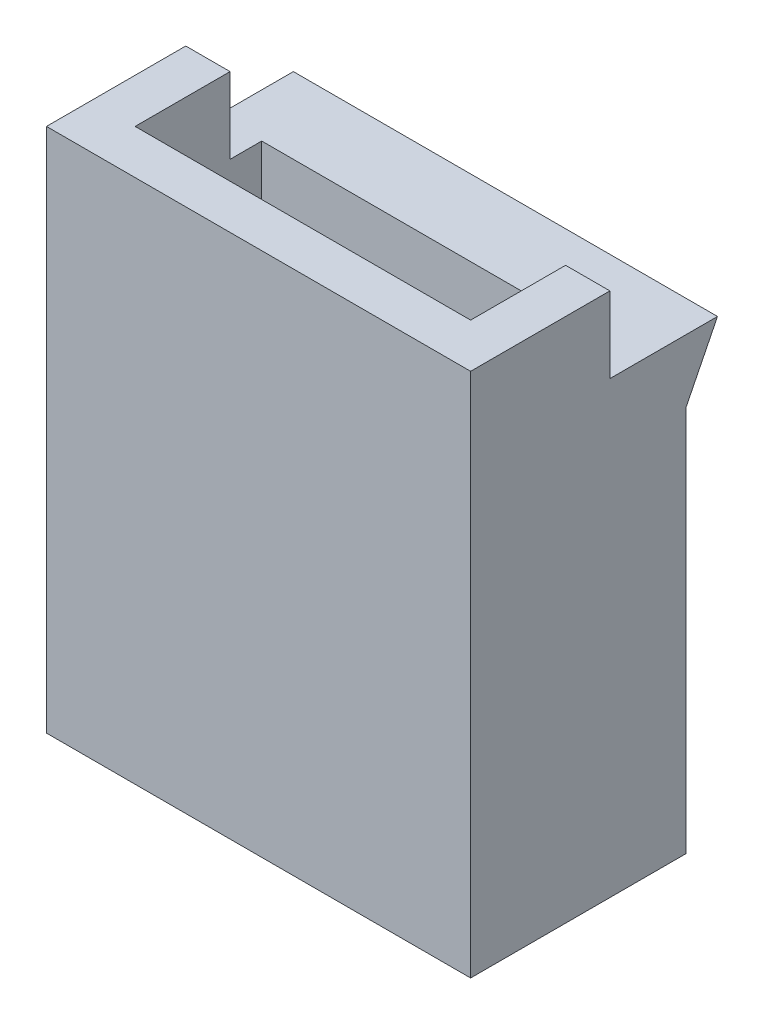
ISO-10303-21;
HEADER;
FILE_DESCRIPTION(('STEP AP214'),'2;1');
FILE_NAME('part.step','',(''),(''),'','','');
FILE_SCHEMA(('AUTOMOTIVE_DESIGN { 1 0 10303 214 1 1 1 1 }'));
ENDSEC;
DATA;
#1=APPLICATION_CONTEXT('core data for automotive mechanical design processes');
#2=APPLICATION_PROTOCOL_DEFINITION('international standard','automotive_design',2000,#1);
#3=PRODUCT_CONTEXT('',#1,'mechanical');
#4=PRODUCT('Part','Part','',(#3));
#5=PRODUCT_RELATED_PRODUCT_CATEGORY('part','',(#4));
#6=PRODUCT_DEFINITION_FORMATION('','',#4);
#7=PRODUCT_DEFINITION_CONTEXT('part definition',#1,'design');
#8=PRODUCT_DEFINITION('design','',#6,#7);
#9=PRODUCT_DEFINITION_SHAPE('','',#8);
#10=(LENGTH_UNIT() NAMED_UNIT(*) SI_UNIT(.MILLI.,.METRE.));
#11=(NAMED_UNIT(*) PLANE_ANGLE_UNIT() SI_UNIT($,.RADIAN.));
#12=(NAMED_UNIT(*) SI_UNIT($,.STERADIAN.) SOLID_ANGLE_UNIT());
#13=UNCERTAINTY_MEASURE_WITH_UNIT(LENGTH_MEASURE(1.E-05),#10,'distance_accuracy_value','');
#14=(GEOMETRIC_REPRESENTATION_CONTEXT(3) GLOBAL_UNCERTAINTY_ASSIGNED_CONTEXT((#13)) GLOBAL_UNIT_ASSIGNED_CONTEXT((#10,
#11,#12)) REPRESENTATION_CONTEXT('',''));
#15=CARTESIAN_POINT('',(0.,0.,0.));
#16=DIRECTION('',(0.,0.,1.));
#17=DIRECTION('',(1.,0.,0.));
#18=AXIS2_PLACEMENT_3D('',#15,#16,#17);
#19=CARTESIAN_POINT('',(0.,0.,0.));
#20=DIRECTION('',(0.,1.,0.));
#21=DIRECTION('',(1.,0.,0.));
#22=AXIS2_PLACEMENT_3D('',#19,#20,#21);
#23=PLANE('',#22);
#24=DIRECTION('',(0.,0.,1.));
#25=VECTOR('',#24,1.);
#26=CARTESIAN_POINT('',(-3.35,0.,-0.5));
#27=LINE('',#26,#25);
#28=CARTESIAN_POINT('',(-3.35,0.,-0.5));
#29=VERTEX_POINT('',#28);
#30=CARTESIAN_POINT('',(-3.35,0.,1.7));
#31=VERTEX_POINT('',#30);
#32=EDGE_CURVE('E11',#29,#31,#27,.T.);
#33=ORIENTED_EDGE('',*,*,#32,.T.);
#34=DIRECTION('',(1.,0.,0.));
#35=VECTOR('',#34,1.);
#36=CARTESIAN_POINT('',(-3.35,0.,1.7));
#37=LINE('',#36,#35);
#38=CARTESIAN_POINT('',(3.35,0.,1.7));
#39=VERTEX_POINT('',#38);
#40=EDGE_CURVE('E27',#31,#39,#37,.T.);
#41=ORIENTED_EDGE('',*,*,#40,.T.);
#42=DIRECTION('',(0.,0.,-1.));
#43=VECTOR('',#42,1.);
#44=CARTESIAN_POINT('',(3.35,0.,1.7));
#45=LINE('',#44,#43);
#46=CARTESIAN_POINT('',(3.35,0.,-0.5));
#47=VERTEX_POINT('',#46);
#48=EDGE_CURVE('E162',#39,#47,#45,.T.);
#49=ORIENTED_EDGE('',*,*,#48,.T.);
#50=DIRECTION('',(1.,0.,0.));
#51=VECTOR('',#50,1.);
#52=CARTESIAN_POINT('',(2.65,0.,-0.5));
#53=LINE('',#52,#51);
#54=CARTESIAN_POINT('',(2.65,0.,-0.5));
#55=VERTEX_POINT('',#54);
#56=EDGE_CURVE('E199',#55,#47,#53,.T.);
#57=ORIENTED_EDGE('',*,*,#56,.F.);
#58=DIRECTION('',(0.,0.,-1.));
#59=VECTOR('',#58,1.);
#60=CARTESIAN_POINT('',(2.65,0.,1.));
#61=LINE('',#60,#59);
#62=CARTESIAN_POINT('',(2.65,0.,1.));
#63=VERTEX_POINT('',#62);
#64=EDGE_CURVE('E152',#63,#55,#61,.T.);
#65=ORIENTED_EDGE('',*,*,#64,.F.);
#66=DIRECTION('',(1.,0.,0.));
#67=VECTOR('',#66,1.);
#68=CARTESIAN_POINT('',(-2.65,0.,1.));
#69=LINE('',#68,#67);
#70=CARTESIAN_POINT('',(-2.65,0.,1.));
#71=VERTEX_POINT('',#70);
#72=EDGE_CURVE('E129',#71,#63,#69,.T.);
#73=ORIENTED_EDGE('',*,*,#72,.F.);
#74=DIRECTION('',(0.,0.,1.));
#75=VECTOR('',#74,1.);
#76=CARTESIAN_POINT('',(-2.65,0.,-0.5));
#77=LINE('',#76,#75);
#78=CARTESIAN_POINT('',(-2.65,0.,-0.5));
#79=VERTEX_POINT('',#78);
#80=EDGE_CURVE('E126',#79,#71,#77,.T.);
#81=ORIENTED_EDGE('',*,*,#80,.F.);
#82=DIRECTION('',(1.,0.,0.));
#83=VECTOR('',#82,1.);
#84=CARTESIAN_POINT('',(-3.35,0.,-0.5));
#85=LINE('',#84,#83);
#86=EDGE_CURVE('E155',#29,#79,#85,.T.);
#87=ORIENTED_EDGE('',*,*,#86,.F.);
#88=EDGE_LOOP('',(#33,#41,#49,#57,#65,#73,#81,#87));
#89=FACE_BOUND('',#88,.T.);
#90=ADVANCED_FACE('F17',(#89),#23,.T.);
#91=CARTESIAN_POINT('',(-3.35,0.,-0.5));
#92=DIRECTION('',(0.,0.,1.));
#93=DIRECTION('',(1.,0.,0.));
#94=AXIS2_PLACEMENT_3D('',#91,#92,#93);
#95=PLANE('',#94);
#96=DIRECTION('',(0.,-1.,0.));
#97=VECTOR('',#96,1.);
#98=CARTESIAN_POINT('',(-2.65,0.,-0.5));
#99=LINE('',#98,#97);
#100=CARTESIAN_POINT('',(-2.65,-1.2,-0.5));
#101=VERTEX_POINT('',#100);
#102=EDGE_CURVE('E158',#79,#101,#99,.T.);
#103=ORIENTED_EDGE('',*,*,#102,.T.);
#104=DIRECTION('',(1.,0.,0.));
#105=VECTOR('',#104,1.);
#106=CARTESIAN_POINT('',(-3.35,-1.2,-0.5));
#107=LINE('',#106,#105);
#108=CARTESIAN_POINT('',(-3.35,-1.2,-0.5));
#109=VERTEX_POINT('',#108);
#110=EDGE_CURVE('E163',#109,#101,#107,.T.);
#111=ORIENTED_EDGE('',*,*,#110,.F.);
#112=DIRECTION('',(0.,-1.,0.));
#113=VECTOR('',#112,1.);
#114=CARTESIAN_POINT('',(-3.35,0.,-0.5));
#115=LINE('',#114,#113);
#116=EDGE_CURVE('E166',#29,#109,#115,.T.);
#117=ORIENTED_EDGE('',*,*,#116,.F.);
#118=ORIENTED_EDGE('',*,*,#86,.T.);
#119=EDGE_LOOP('',(#103,#111,#117,#118));
#120=FACE_BOUND('',#119,.T.);
#121=ADVANCED_FACE('F251',(#120),#95,.F.);
#122=CARTESIAN_POINT('',(-3.35,0.,-1.7));
#123=DIRECTION('',(-1.,0.,0.));
#124=DIRECTION('',(0.,0.,1.));
#125=AXIS2_PLACEMENT_3D('',#122,#123,#124);
#126=PLANE('',#125);
#127=DIRECTION('',(0.,-1.,0.));
#128=VECTOR('',#127,1.);
#129=CARTESIAN_POINT('',(-3.35,-2.2,-1.7));
#130=LINE('',#129,#128);
#131=CARTESIAN_POINT('',(-3.35,-2.2,-1.7));
#132=VERTEX_POINT('',#131);
#133=CARTESIAN_POINT('',(-3.35,-8.3,-1.7));
#134=VERTEX_POINT('',#133);
#135=EDGE_CURVE('E159',#132,#134,#130,.T.);
#136=ORIENTED_EDGE('',*,*,#135,.T.);
#137=DIRECTION('',(0.,0.,1.));
#138=VECTOR('',#137,1.);
#139=CARTESIAN_POINT('',(-3.35,-8.3,-1.7));
#140=LINE('',#139,#138);
#141=CARTESIAN_POINT('',(-3.35,-8.3,1.7));
#142=VERTEX_POINT('',#141);
#143=EDGE_CURVE('E169',#134,#142,#140,.T.);
#144=ORIENTED_EDGE('',*,*,#143,.T.);
#145=DIRECTION('',(0.,-1.,0.));
#146=VECTOR('',#145,1.);
#147=CARTESIAN_POINT('',(-3.35,0.,1.7));
#148=LINE('',#147,#146);
#149=EDGE_CURVE('E175',#31,#142,#148,.T.);
#150=ORIENTED_EDGE('',*,*,#149,.F.);
#151=ORIENTED_EDGE('',*,*,#32,.F.);
#152=ORIENTED_EDGE('',*,*,#116,.T.);
#153=DIRECTION('',(0.,0.,1.));
#154=VECTOR('',#153,1.);
#155=CARTESIAN_POINT('',(-3.35,-1.2,-2.2));
#156=LINE('',#155,#154);
#157=CARTESIAN_POINT('',(-3.35,-1.2,-2.2));
#158=VERTEX_POINT('',#157);
#159=EDGE_CURVE('E165',#158,#109,#156,.T.);
#160=ORIENTED_EDGE('',*,*,#159,.F.);
#161=DIRECTION('',(0.,0.894427190999896,-0.447213595499998));
#162=VECTOR('',#161,1.);
#163=CARTESIAN_POINT('',(-3.35,-2.2,-1.7));
#164=LINE('',#163,#162);
#165=EDGE_CURVE('E170',#132,#158,#164,.T.);
#166=ORIENTED_EDGE('',*,*,#165,.F.);
#167=EDGE_LOOP('',(#136,#144,#150,#151,#152,#160,#166));
#168=FACE_BOUND('',#167,.T.);
#169=ADVANCED_FACE('F256',(#168),#126,.T.);
#170=CARTESIAN_POINT('',(0.,-1.7,-1.95));
#171=DIRECTION('',(0.,-0.447213595499998,-0.894427190999896));
#172=DIRECTION('',(0.,0.894427190999896,-0.447213595499998));
#173=AXIS2_PLACEMENT_3D('',#170,#171,#172);
#174=PLANE('',#173);
#175=DIRECTION('',(1.,0.,0.));
#176=VECTOR('',#175,1.);
#177=CARTESIAN_POINT('',(-3.35,-2.2,-1.7));
#178=LINE('',#177,#176);
#179=CARTESIAN_POINT('',(3.35,-2.2,-1.7));
#180=VERTEX_POINT('',#179);
#181=EDGE_CURVE('E177',#132,#180,#178,.T.);
#182=ORIENTED_EDGE('',*,*,#181,.F.);
#183=ORIENTED_EDGE('',*,*,#165,.T.);
#184=DIRECTION('',(1.,0.,0.));
#185=VECTOR('',#184,1.);
#186=CARTESIAN_POINT('',(-3.35,-1.2,-2.2));
#187=LINE('',#186,#185);
#188=CARTESIAN_POINT('',(3.35,-1.2,-2.2));
#189=VERTEX_POINT('',#188);
#190=EDGE_CURVE('E184',#158,#189,#187,.T.);
#191=ORIENTED_EDGE('',*,*,#190,.T.);
#192=DIRECTION('',(0.,-0.894427190999896,0.447213595499998));
#193=VECTOR('',#192,1.);
#194=CARTESIAN_POINT('',(3.35,-1.2,-2.2));
#195=LINE('',#194,#193);
#196=EDGE_CURVE('E189',#189,#180,#195,.T.);
#197=ORIENTED_EDGE('',*,*,#196,.T.);
#198=EDGE_LOOP('',(#182,#183,#191,#197));
#199=FACE_BOUND('',#198,.T.);
#200=ADVANCED_FACE('F262',(#199),#174,.T.);
#201=CARTESIAN_POINT('',(3.35,0.,1.7));
#202=DIRECTION('',(1.,0.,0.));
#203=DIRECTION('',(0.,0.,-1.));
#204=AXIS2_PLACEMENT_3D('',#201,#202,#203);
#205=PLANE('',#204);
#206=DIRECTION('',(0.,0.,-1.));
#207=VECTOR('',#206,1.);
#208=CARTESIAN_POINT('',(3.35,-1.2,-0.5));
#209=LINE('',#208,#207);
#210=CARTESIAN_POINT('',(3.35,-1.2,-0.5));
#211=VERTEX_POINT('',#210);
#212=EDGE_CURVE('E143',#211,#189,#209,.T.);
#213=ORIENTED_EDGE('',*,*,#212,.F.);
#214=DIRECTION('',(0.,-1.,0.));
#215=VECTOR('',#214,1.);
#216=CARTESIAN_POINT('',(3.35,0.,-0.5));
#217=LINE('',#216,#215);
#218=EDGE_CURVE('E196',#47,#211,#217,.T.);
#219=ORIENTED_EDGE('',*,*,#218,.F.);
#220=ORIENTED_EDGE('',*,*,#48,.F.);
#221=DIRECTION('',(0.,-1.,0.));
#222=VECTOR('',#221,1.);
#223=CARTESIAN_POINT('',(3.35,0.,1.7));
#224=LINE('',#223,#222);
#225=CARTESIAN_POINT('',(3.35,-8.3,1.7));
#226=VERTEX_POINT('',#225);
#227=EDGE_CURVE('E192',#39,#226,#224,.T.);
#228=ORIENTED_EDGE('',*,*,#227,.T.);
#229=DIRECTION('',(0.,0.,-1.));
#230=VECTOR('',#229,1.);
#231=CARTESIAN_POINT('',(3.35,-8.3,1.7));
#232=LINE('',#231,#230);
#233=CARTESIAN_POINT('',(3.35,-8.3,-1.7));
#234=VERTEX_POINT('',#233);
#235=EDGE_CURVE('E202',#226,#234,#232,.T.);
#236=ORIENTED_EDGE('',*,*,#235,.T.);
#237=DIRECTION('',(0.,-1.,0.));
#238=VECTOR('',#237,1.);
#239=CARTESIAN_POINT('',(3.35,-2.2,-1.7));
#240=LINE('',#239,#238);
#241=EDGE_CURVE('E205',#180,#234,#240,.T.);
#242=ORIENTED_EDGE('',*,*,#241,.F.);
#243=ORIENTED_EDGE('',*,*,#196,.F.);
#244=EDGE_LOOP('',(#213,#219,#220,#228,#236,#242,#243));
#245=FACE_BOUND('',#244,.T.);
#246=ADVANCED_FACE('F230',(#245),#205,.T.);
#247=CARTESIAN_POINT('',(3.35,0.,-1.7));
#248=DIRECTION('',(0.,0.,-1.));
#249=DIRECTION('',(-1.,0.,0.));
#250=AXIS2_PLACEMENT_3D('',#247,#248,#249);
#251=PLANE('',#250);
#252=ORIENTED_EDGE('',*,*,#241,.T.);
#253=DIRECTION('',(-1.,0.,0.));
#254=VECTOR('',#253,1.);
#255=CARTESIAN_POINT('',(3.35,-8.3,-1.7));
#256=LINE('',#255,#254);
#257=EDGE_CURVE('E186',#234,#134,#256,.T.);
#258=ORIENTED_EDGE('',*,*,#257,.T.);
#259=ORIENTED_EDGE('',*,*,#135,.F.);
#260=ORIENTED_EDGE('',*,*,#181,.T.);
#261=EDGE_LOOP('',(#252,#258,#259,#260));
#262=FACE_BOUND('',#261,.T.);
#263=ADVANCED_FACE('F269',(#262),#251,.T.);
#264=CARTESIAN_POINT('',(0.,-8.3,0.));
#265=DIRECTION('',(0.,1.,0.));
#266=DIRECTION('',(1.,0.,0.));
#267=AXIS2_PLACEMENT_3D('',#264,#265,#266);
#268=PLANE('',#267);
#269=ORIENTED_EDGE('',*,*,#143,.F.);
#270=ORIENTED_EDGE('',*,*,#257,.F.);
#271=ORIENTED_EDGE('',*,*,#235,.F.);
#272=DIRECTION('',(1.,0.,0.));
#273=VECTOR('',#272,1.);
#274=CARTESIAN_POINT('',(-3.35,-8.3,1.7));
#275=LINE('',#274,#273);
#276=EDGE_CURVE('E178',#142,#226,#275,.T.);
#277=ORIENTED_EDGE('',*,*,#276,.F.);
#278=EDGE_LOOP('',(#269,#270,#271,#277));
#279=FACE_BOUND('',#278,.T.);
#280=ADVANCED_FACE('F272',(#279),#268,.F.);
#281=CARTESIAN_POINT('',(-3.35,0.,1.7));
#282=DIRECTION('',(0.,0.,1.));
#283=DIRECTION('',(1.,0.,0.));
#284=AXIS2_PLACEMENT_3D('',#281,#282,#283);
#285=PLANE('',#284);
#286=ORIENTED_EDGE('',*,*,#149,.T.);
#287=ORIENTED_EDGE('',*,*,#276,.T.);
#288=ORIENTED_EDGE('',*,*,#227,.F.);
#289=ORIENTED_EDGE('',*,*,#40,.F.);
#290=EDGE_LOOP('',(#286,#287,#288,#289));
#291=FACE_BOUND('',#290,.T.);
#292=ADVANCED_FACE('F227',(#291),#285,.T.);
#293=CARTESIAN_POINT('',(-3.35,0.,-0.5));
#294=DIRECTION('',(0.,0.,1.));
#295=DIRECTION('',(1.,0.,0.));
#296=AXIS2_PLACEMENT_3D('',#293,#294,#295);
#297=PLANE('',#296);
#298=ORIENTED_EDGE('',*,*,#218,.T.);
#299=DIRECTION('',(1.,0.,0.));
#300=VECTOR('',#299,1.);
#301=CARTESIAN_POINT('',(2.65,-1.2,-0.5));
#302=LINE('',#301,#300);
#303=CARTESIAN_POINT('',(2.65,-1.2,-0.5));
#304=VERTEX_POINT('',#303);
#305=EDGE_CURVE('E195',#304,#211,#302,.T.);
#306=ORIENTED_EDGE('',*,*,#305,.F.);
#307=DIRECTION('',(0.,-1.,0.));
#308=VECTOR('',#307,1.);
#309=CARTESIAN_POINT('',(2.65,0.,-0.5));
#310=LINE('',#309,#308);
#311=EDGE_CURVE('E181',#55,#304,#310,.T.);
#312=ORIENTED_EDGE('',*,*,#311,.F.);
#313=ORIENTED_EDGE('',*,*,#56,.T.);
#314=EDGE_LOOP('',(#298,#306,#312,#313));
#315=FACE_BOUND('',#314,.T.);
#316=ADVANCED_FACE('F233',(#315),#297,.F.);
#317=CARTESIAN_POINT('',(2.65,0.,1.7));
#318=DIRECTION('',(1.,0.,0.));
#319=DIRECTION('',(0.,0.,-1.));
#320=AXIS2_PLACEMENT_3D('',#317,#318,#319);
#321=PLANE('',#320);
#322=DIRECTION('',(0.,-1.,0.));
#323=VECTOR('',#322,1.);
#324=CARTESIAN_POINT('',(2.65,-1.2,-1.));
#325=LINE('',#324,#323);
#326=CARTESIAN_POINT('',(2.65,-1.2,-1.));
#327=VERTEX_POINT('',#326);
#328=CARTESIAN_POINT('',(2.65,-7.6,-1.));
#329=VERTEX_POINT('',#328);
#330=EDGE_CURVE('E147',#327,#329,#325,.T.);
#331=ORIENTED_EDGE('',*,*,#330,.T.);
#332=DIRECTION('',(0.,0.,-1.));
#333=VECTOR('',#332,1.);
#334=CARTESIAN_POINT('',(2.65,-7.6,1.));
#335=LINE('',#334,#333);
#336=CARTESIAN_POINT('',(2.65,-7.6,1.));
#337=VERTEX_POINT('',#336);
#338=EDGE_CURVE('E141',#337,#329,#335,.T.);
#339=ORIENTED_EDGE('',*,*,#338,.F.);
#340=DIRECTION('',(0.,-1.,0.));
#341=VECTOR('',#340,1.);
#342=CARTESIAN_POINT('',(2.65,0.,1.));
#343=LINE('',#342,#341);
#344=EDGE_CURVE('E117',#63,#337,#343,.T.);
#345=ORIENTED_EDGE('',*,*,#344,.F.);
#346=ORIENTED_EDGE('',*,*,#64,.T.);
#347=ORIENTED_EDGE('',*,*,#311,.T.);
#348=DIRECTION('',(0.,0.,1.));
#349=VECTOR('',#348,1.);
#350=CARTESIAN_POINT('',(2.65,-1.2,-1.));
#351=LINE('',#350,#349);
#352=EDGE_CURVE('E135',#327,#304,#351,.T.);
#353=ORIENTED_EDGE('',*,*,#352,.F.);
#354=EDGE_LOOP('',(#331,#339,#345,#346,#347,#353));
#355=FACE_BOUND('',#354,.T.);
#356=ADVANCED_FACE('F238',(#355),#321,.F.);
#357=CARTESIAN_POINT('',(0.,-1.2,0.));
#358=DIRECTION('',(0.,1.,0.));
#359=DIRECTION('',(-1.,0.,0.));
#360=AXIS2_PLACEMENT_3D('',#357,#358,#359);
#361=PLANE('',#360);
#362=ORIENTED_EDGE('',*,*,#159,.T.);
#363=ORIENTED_EDGE('',*,*,#110,.T.);
#364=DIRECTION('',(0.,0.,1.));
#365=VECTOR('',#364,1.);
#366=CARTESIAN_POINT('',(-2.65,-1.2,-1.));
#367=LINE('',#366,#365);
#368=CARTESIAN_POINT('',(-2.65,-1.2,-1.));
#369=VERTEX_POINT('',#368);
#370=EDGE_CURVE('E128',#369,#101,#367,.T.);
#371=ORIENTED_EDGE('',*,*,#370,.F.);
#372=DIRECTION('',(-1.,0.,0.));
#373=VECTOR('',#372,1.);
#374=CARTESIAN_POINT('',(2.65,-1.2,-1.));
#375=LINE('',#374,#373);
#376=EDGE_CURVE('E137',#327,#369,#375,.T.);
#377=ORIENTED_EDGE('',*,*,#376,.F.);
#378=ORIENTED_EDGE('',*,*,#352,.T.);
#379=ORIENTED_EDGE('',*,*,#305,.T.);
#380=ORIENTED_EDGE('',*,*,#212,.T.);
#381=ORIENTED_EDGE('',*,*,#190,.F.);
#382=EDGE_LOOP('',(#362,#363,#371,#377,#378,#379,#380,#381));
#383=FACE_BOUND('',#382,.T.);
#384=ADVANCED_FACE('F235',(#383),#361,.T.);
#385=CARTESIAN_POINT('',(3.35,0.,-1.));
#386=DIRECTION('',(0.,0.,-1.));
#387=DIRECTION('',(-1.,0.,0.));
#388=AXIS2_PLACEMENT_3D('',#385,#386,#387);
#389=PLANE('',#388);
#390=DIRECTION('',(0.,-1.,0.));
#391=VECTOR('',#390,1.);
#392=CARTESIAN_POINT('',(-2.65,-1.2,-1.));
#393=LINE('',#392,#391);
#394=CARTESIAN_POINT('',(-2.65,-7.6,-1.));
#395=VERTEX_POINT('',#394);
#396=EDGE_CURVE('E140',#369,#395,#393,.T.);
#397=ORIENTED_EDGE('',*,*,#396,.T.);
#398=DIRECTION('',(-1.,0.,0.));
#399=VECTOR('',#398,1.);
#400=CARTESIAN_POINT('',(2.65,-7.6,-1.));
#401=LINE('',#400,#399);
#402=EDGE_CURVE('E107',#329,#395,#401,.T.);
#403=ORIENTED_EDGE('',*,*,#402,.F.);
#404=ORIENTED_EDGE('',*,*,#330,.F.);
#405=ORIENTED_EDGE('',*,*,#376,.T.);
#406=EDGE_LOOP('',(#397,#403,#404,#405));
#407=FACE_BOUND('',#406,.T.);
#408=ADVANCED_FACE('F240',(#407),#389,.F.);
#409=CARTESIAN_POINT('',(0.,-7.6,0.));
#410=DIRECTION('',(0.,1.,0.));
#411=DIRECTION('',(1.,0.,0.));
#412=AXIS2_PLACEMENT_3D('',#409,#410,#411);
#413=PLANE('',#412);
#414=ORIENTED_EDGE('',*,*,#338,.T.);
#415=ORIENTED_EDGE('',*,*,#402,.T.);
#416=DIRECTION('',(0.,0.,1.));
#417=VECTOR('',#416,1.);
#418=CARTESIAN_POINT('',(-2.65,-7.6,-1.));
#419=LINE('',#418,#417);
#420=CARTESIAN_POINT('',(-2.65,-7.6,1.));
#421=VERTEX_POINT('',#420);
#422=EDGE_CURVE('E119',#395,#421,#419,.T.);
#423=ORIENTED_EDGE('',*,*,#422,.T.);
#424=DIRECTION('',(1.,0.,0.));
#425=VECTOR('',#424,1.);
#426=CARTESIAN_POINT('',(-2.65,-7.6,1.));
#427=LINE('',#426,#425);
#428=EDGE_CURVE('E113',#421,#337,#427,.T.);
#429=ORIENTED_EDGE('',*,*,#428,.T.);
#430=EDGE_LOOP('',(#414,#415,#423,#429));
#431=FACE_BOUND('',#430,.T.);
#432=ADVANCED_FACE('F121',(#431),#413,.T.);
#433=CARTESIAN_POINT('',(-3.35,0.,1.));
#434=DIRECTION('',(0.,0.,1.));
#435=DIRECTION('',(1.,0.,0.));
#436=AXIS2_PLACEMENT_3D('',#433,#434,#435);
#437=PLANE('',#436);
#438=ORIENTED_EDGE('',*,*,#344,.T.);
#439=ORIENTED_EDGE('',*,*,#428,.F.);
#440=DIRECTION('',(0.,-1.,0.));
#441=VECTOR('',#440,1.);
#442=CARTESIAN_POINT('',(-2.65,0.,1.));
#443=LINE('',#442,#441);
#444=EDGE_CURVE('E21',#71,#421,#443,.T.);
#445=ORIENTED_EDGE('',*,*,#444,.F.);
#446=ORIENTED_EDGE('',*,*,#72,.T.);
#447=EDGE_LOOP('',(#438,#439,#445,#446));
#448=FACE_BOUND('',#447,.T.);
#449=ADVANCED_FACE('F114',(#448),#437,.F.);
#450=CARTESIAN_POINT('',(-2.65,0.,-1.7));
#451=DIRECTION('',(-1.,0.,0.));
#452=DIRECTION('',(0.,0.,1.));
#453=AXIS2_PLACEMENT_3D('',#450,#451,#452);
#454=PLANE('',#453);
#455=ORIENTED_EDGE('',*,*,#102,.F.);
#456=ORIENTED_EDGE('',*,*,#80,.T.);
#457=ORIENTED_EDGE('',*,*,#444,.T.);
#458=ORIENTED_EDGE('',*,*,#422,.F.);
#459=ORIENTED_EDGE('',*,*,#396,.F.);
#460=ORIENTED_EDGE('',*,*,#370,.T.);
#461=EDGE_LOOP('',(#455,#456,#457,#458,#459,#460));
#462=FACE_BOUND('',#461,.T.);
#463=ADVANCED_FACE('F19',(#462),#454,.F.);
#464=CLOSED_SHELL('',(#90,#121,#169,#200,#246,#263,#280,#292,#316,#356,#384,#408,#432,#449,#463));
#465=MANIFOLD_SOLID_BREP('B1',#464);
#466=ADVANCED_BREP_SHAPE_REPRESENTATION('',(#18,#465),#14);
#467=SHAPE_DEFINITION_REPRESENTATION(#9,#466);
ENDSEC;
END-ISO-10303-21;
